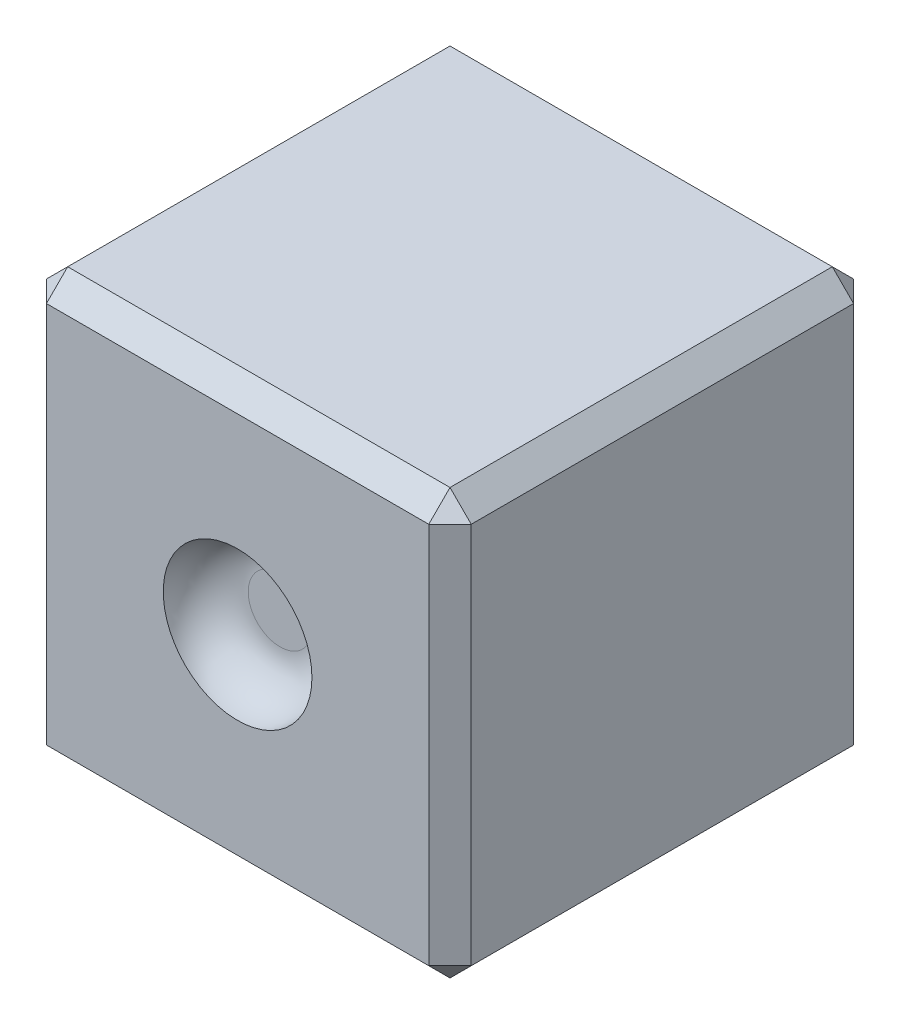
ISO-10303-21;
HEADER;
FILE_DESCRIPTION(('STEP AP214'),'2;1');
FILE_NAME('part.step','',(''),(''),'','','');
FILE_SCHEMA(('AUTOMOTIVE_DESIGN { 1 0 10303 214 1 1 1 1 }'));
ENDSEC;
DATA;
#1=APPLICATION_CONTEXT('core data for automotive mechanical design processes');
#2=APPLICATION_PROTOCOL_DEFINITION('international standard','automotive_design',2000,#1);
#3=PRODUCT_CONTEXT('',#1,'mechanical');
#4=PRODUCT('Part','Part','',(#3));
#5=PRODUCT_RELATED_PRODUCT_CATEGORY('part','',(#4));
#6=PRODUCT_DEFINITION_FORMATION('','',#4);
#7=PRODUCT_DEFINITION_CONTEXT('part definition',#1,'design');
#8=PRODUCT_DEFINITION('design','',#6,#7);
#9=PRODUCT_DEFINITION_SHAPE('','',#8);
#10=(LENGTH_UNIT() NAMED_UNIT(*) SI_UNIT(.MILLI.,.METRE.));
#11=(NAMED_UNIT(*) PLANE_ANGLE_UNIT() SI_UNIT($,.RADIAN.));
#12=(NAMED_UNIT(*) SI_UNIT($,.STERADIAN.) SOLID_ANGLE_UNIT());
#13=UNCERTAINTY_MEASURE_WITH_UNIT(LENGTH_MEASURE(1.E-05),#10,'distance_accuracy_value','');
#14=(GEOMETRIC_REPRESENTATION_CONTEXT(3) GLOBAL_UNCERTAINTY_ASSIGNED_CONTEXT((#13)) GLOBAL_UNIT_ASSIGNED_CONTEXT((#10,
#11,#12)) REPRESENTATION_CONTEXT('',''));
#15=CARTESIAN_POINT('',(0.,0.,0.));
#16=DIRECTION('',(0.,0.,1.));
#17=DIRECTION('',(1.,0.,0.));
#18=AXIS2_PLACEMENT_3D('',#15,#16,#17);
#19=CARTESIAN_POINT('',(-24.5864661654135,15.1691729323308,20.));
#20=DIRECTION('',(1.,0.,0.));
#21=DIRECTION('',(0.,1.,0.));
#22=AXIS2_PLACEMENT_3D('',#19,#20,#21);
#23=PLANE('',#22);
#24=DIRECTION('',(0.,0.,-1.));
#25=VECTOR('',#24,1.);
#26=CARTESIAN_POINT('',(-24.5864661654135,-4.83082706766917,20.));
#27=LINE('',#26,#25);
#28=CARTESIAN_POINT('',(-24.5864661654135,-4.83082706766917,19.));
#29=VERTEX_POINT('',#28);
#30=CARTESIAN_POINT('',(-24.5864661654135,-4.83082706766917,0.));
#31=VERTEX_POINT('',#30);
#32=EDGE_CURVE('E120',#29,#31,#27,.T.);
#33=ORIENTED_EDGE('',*,*,#32,.F.);
#34=DIRECTION('',(0.,1.,0.));
#35=VECTOR('',#34,1.);
#36=CARTESIAN_POINT('',(-24.5864661654135,15.1691729323308,19.));
#37=LINE('',#36,#35);
#38=CARTESIAN_POINT('',(-24.5864661654135,14.1691729323308,19.));
#39=VERTEX_POINT('',#38);
#40=EDGE_CURVE('E70',#29,#39,#37,.T.);
#41=ORIENTED_EDGE('',*,*,#40,.T.);
#42=DIRECTION('',(0.,0.,-1.));
#43=VECTOR('',#42,1.);
#44=CARTESIAN_POINT('',(-24.5864661654135,14.1691729323308,20.));
#45=LINE('',#44,#43);
#46=CARTESIAN_POINT('',(-24.5864661654135,14.1691729323308,0.));
#47=VERTEX_POINT('',#46);
#48=EDGE_CURVE('E130',#39,#47,#45,.T.);
#49=ORIENTED_EDGE('',*,*,#48,.T.);
#50=DIRECTION('',(0.,-1.,0.));
#51=VECTOR('',#50,1.);
#52=CARTESIAN_POINT('',(-24.5864661654135,15.1691729323308,0.));
#53=LINE('',#52,#51);
#54=EDGE_CURVE('E128',#47,#31,#53,.T.);
#55=ORIENTED_EDGE('',*,*,#54,.T.);
#56=EDGE_LOOP('',(#33,#41,#49,#55));
#57=FACE_BOUND('',#56,.T.);
#58=ADVANCED_FACE('F47',(#57),#23,.F.);
#59=CARTESIAN_POINT('',(-24.5864661654135,-4.83082706766917,20.));
#60=DIRECTION('',(0.,1.,0.));
#61=DIRECTION('',(0.,0.,1.));
#62=AXIS2_PLACEMENT_3D('',#59,#60,#61);
#63=PLANE('',#62);
#64=DIRECTION('',(0.,0.,1.));
#65=VECTOR('',#64,1.);
#66=CARTESIAN_POINT('',(-5.58646616541355,-4.83082706766917,20.));
#67=LINE('',#66,#65);
#68=CARTESIAN_POINT('',(-5.58646616541355,-4.83082706766917,0.));
#69=VERTEX_POINT('',#68);
#70=CARTESIAN_POINT('',(-5.58646616541355,-4.83082706766917,19.));
#71=VERTEX_POINT('',#70);
#72=EDGE_CURVE('E62',#69,#71,#67,.T.);
#73=ORIENTED_EDGE('',*,*,#72,.T.);
#74=DIRECTION('',(-1.,0.,0.));
#75=VECTOR('',#74,1.);
#76=CARTESIAN_POINT('',(-24.5864661654135,-4.83082706766917,19.));
#77=LINE('',#76,#75);
#78=EDGE_CURVE('E55',#71,#29,#77,.T.);
#79=ORIENTED_EDGE('',*,*,#78,.T.);
#80=ORIENTED_EDGE('',*,*,#32,.T.);
#81=DIRECTION('',(1.,0.,0.));
#82=VECTOR('',#81,1.);
#83=CARTESIAN_POINT('',(-24.5864661654135,-4.83082706766917,0.));
#84=LINE('',#83,#82);
#85=EDGE_CURVE('E124',#31,#69,#84,.T.);
#86=ORIENTED_EDGE('',*,*,#85,.T.);
#87=EDGE_LOOP('',(#73,#79,#80,#86));
#88=FACE_BOUND('',#87,.T.);
#89=ADVANCED_FACE('F122',(#88),#63,.F.);
#90=CARTESIAN_POINT('',(-4.58646616541355,15.1691729323308,20.));
#91=DIRECTION('',(-1.,0.,0.));
#92=DIRECTION('',(0.,-1.,0.));
#93=AXIS2_PLACEMENT_3D('',#90,#91,#92);
#94=PLANE('',#93);
#95=DIRECTION('',(0.,0.,-1.));
#96=VECTOR('',#95,1.);
#97=CARTESIAN_POINT('',(-4.58646616541354,-3.83082706766917,20.));
#98=LINE('',#97,#96);
#99=CARTESIAN_POINT('',(-4.58646616541354,-3.83082706766917,19.));
#100=VERTEX_POINT('',#99);
#101=CARTESIAN_POINT('',(-4.58646616541354,-3.83082706766917,0.999999999999997));
#102=VERTEX_POINT('',#101);
#103=EDGE_CURVE('E125',#100,#102,#98,.T.);
#104=ORIENTED_EDGE('',*,*,#103,.T.);
#105=DIRECTION('',(0.,1.,0.));
#106=VECTOR('',#105,1.);
#107=CARTESIAN_POINT('',(-4.58646616541355,15.1691729323308,0.999999999999997));
#108=LINE('',#107,#106);
#109=CARTESIAN_POINT('',(-4.58646616541355,14.1691729323308,0.999999999999997));
#110=VERTEX_POINT('',#109);
#111=EDGE_CURVE('E147',#102,#110,#108,.T.);
#112=ORIENTED_EDGE('',*,*,#111,.T.);
#113=DIRECTION('',(0.,0.,1.));
#114=VECTOR('',#113,1.);
#115=CARTESIAN_POINT('',(-4.58646616541355,14.1691729323308,20.));
#116=LINE('',#115,#114);
#117=CARTESIAN_POINT('',(-4.58646616541355,14.1691729323308,19.));
#118=VERTEX_POINT('',#117);
#119=EDGE_CURVE('E145',#110,#118,#116,.T.);
#120=ORIENTED_EDGE('',*,*,#119,.T.);
#121=DIRECTION('',(0.,-1.,0.));
#122=VECTOR('',#121,1.);
#123=CARTESIAN_POINT('',(-4.58646616541354,-4.83082706766917,19.));
#124=LINE('',#123,#122);
#125=EDGE_CURVE('E143',#118,#100,#124,.T.);
#126=ORIENTED_EDGE('',*,*,#125,.T.);
#127=EDGE_LOOP('',(#104,#112,#120,#126));
#128=FACE_BOUND('',#127,.T.);
#129=ADVANCED_FACE('F245',(#128),#94,.F.);
#130=CARTESIAN_POINT('',(-24.5864661654135,15.1691729323308,20.));
#131=DIRECTION('',(0.,-1.,0.));
#132=DIRECTION('',(0.,0.,-1.));
#133=AXIS2_PLACEMENT_3D('',#130,#131,#132);
#134=PLANE('',#133);
#135=DIRECTION('',(0.,0.,-1.));
#136=VECTOR('',#135,1.);
#137=CARTESIAN_POINT('',(-5.58646616541355,15.1691729323308,20.));
#138=LINE('',#137,#136);
#139=CARTESIAN_POINT('',(-5.58646616541355,15.1691729323308,19.));
#140=VERTEX_POINT('',#139);
#141=CARTESIAN_POINT('',(-5.58646616541355,15.1691729323308,0.999999999999997));
#142=VERTEX_POINT('',#141);
#143=EDGE_CURVE('E153',#140,#142,#138,.T.);
#144=ORIENTED_EDGE('',*,*,#143,.T.);
#145=DIRECTION('',(-1.,0.,0.));
#146=VECTOR('',#145,1.);
#147=CARTESIAN_POINT('',(-24.5864661654135,15.1691729323308,0.999999999999997));
#148=LINE('',#147,#146);
#149=CARTESIAN_POINT('',(-23.5864661654135,15.1691729323308,0.999999999999997));
#150=VERTEX_POINT('',#149);
#151=EDGE_CURVE('E159',#142,#150,#148,.T.);
#152=ORIENTED_EDGE('',*,*,#151,.T.);
#153=DIRECTION('',(0.,0.,1.));
#154=VECTOR('',#153,1.);
#155=CARTESIAN_POINT('',(-23.5864661654135,15.1691729323308,20.));
#156=LINE('',#155,#154);
#157=CARTESIAN_POINT('',(-23.5864661654135,15.1691729323308,19.));
#158=VERTEX_POINT('',#157);
#159=EDGE_CURVE('E157',#150,#158,#156,.T.);
#160=ORIENTED_EDGE('',*,*,#159,.T.);
#161=DIRECTION('',(1.,0.,0.));
#162=VECTOR('',#161,1.);
#163=CARTESIAN_POINT('',(-4.58646616541355,15.1691729323308,19.));
#164=LINE('',#163,#162);
#165=EDGE_CURVE('E155',#158,#140,#164,.T.);
#166=ORIENTED_EDGE('',*,*,#165,.T.);
#167=EDGE_LOOP('',(#144,#152,#160,#166));
#168=FACE_BOUND('',#167,.T.);
#169=ADVANCED_FACE('F271',(#168),#134,.F.);
#170=CARTESIAN_POINT('',(0.,0.,20.));
#171=DIRECTION('',(0.,0.,1.));
#172=DIRECTION('',(1.,0.,0.));
#173=AXIS2_PLACEMENT_3D('',#170,#171,#172);
#174=PLANE('',#173);
#175=CARTESIAN_POINT('',(-14.5864661654135,5.16917293233083,20.));
#176=DIRECTION('',(0.,0.,1.));
#177=DIRECTION('',(1.,0.,0.));
#178=AXIS2_PLACEMENT_3D('',#175,#176,#177);
#179=CIRCLE('',#178,3.5);
#180=CARTESIAN_POINT('',(-11.0864661654135,5.16917293233083,20.));
#181=VERTEX_POINT('',#180);
#182=EDGE_CURVE('E178',#181,#181,#179,.T.);
#183=ORIENTED_EDGE('',*,*,#182,.F.);
#184=EDGE_LOOP('',(#183));
#185=FACE_BOUND('',#184,.T.);
#186=DIRECTION('',(-1.,0.,0.));
#187=VECTOR('',#186,1.);
#188=CARTESIAN_POINT('',(-24.5864661654135,14.1691729323308,20.));
#189=LINE('',#188,#187);
#190=CARTESIAN_POINT('',(-5.58646616541355,14.1691729323308,20.));
#191=VERTEX_POINT('',#190);
#192=CARTESIAN_POINT('',(-23.5864661654136,14.1691729323308,20.));
#193=VERTEX_POINT('',#192);
#194=EDGE_CURVE('E164',#191,#193,#189,.T.);
#195=ORIENTED_EDGE('',*,*,#194,.T.);
#196=DIRECTION('',(0.,-1.,0.));
#197=VECTOR('',#196,1.);
#198=CARTESIAN_POINT('',(-23.5864661654135,-4.83082706766917,20.));
#199=LINE('',#198,#197);
#200=CARTESIAN_POINT('',(-23.5864661654135,-3.83082706766917,20.));
#201=VERTEX_POINT('',#200);
#202=EDGE_CURVE('E168',#193,#201,#199,.T.);
#203=ORIENTED_EDGE('',*,*,#202,.T.);
#204=DIRECTION('',(1.,0.,0.));
#205=VECTOR('',#204,1.);
#206=CARTESIAN_POINT('',(-4.58646616541354,-3.83082706766917,20.));
#207=LINE('',#206,#205);
#208=CARTESIAN_POINT('',(-5.58646616541355,-3.83082706766917,20.));
#209=VERTEX_POINT('',#208);
#210=EDGE_CURVE('E166',#201,#209,#207,.T.);
#211=ORIENTED_EDGE('',*,*,#210,.T.);
#212=DIRECTION('',(0.,1.,0.));
#213=VECTOR('',#212,1.);
#214=CARTESIAN_POINT('',(-5.58646616541355,15.1691729323308,20.));
#215=LINE('',#214,#213);
#216=EDGE_CURVE('E162',#209,#191,#215,.T.);
#217=ORIENTED_EDGE('',*,*,#216,.T.);
#218=EDGE_LOOP('',(#195,#203,#211,#217));
#219=FACE_BOUND('',#218,.T.);
#220=ADVANCED_FACE('F261',(#185,#219),#174,.T.);
#221=CARTESIAN_POINT('',(0.,0.,0.));
#222=DIRECTION('',(0.,0.,1.));
#223=DIRECTION('',(1.,0.,0.));
#224=AXIS2_PLACEMENT_3D('',#221,#222,#223);
#225=PLANE('',#224);
#226=DIRECTION('',(1.,0.,0.));
#227=VECTOR('',#226,1.);
#228=CARTESIAN_POINT('',(0.,14.1691729323308,0.));
#229=LINE('',#228,#227);
#230=CARTESIAN_POINT('',(-5.58646616541355,14.1691729323308,0.));
#231=VERTEX_POINT('',#230);
#232=EDGE_CURVE('E150',#47,#231,#229,.T.);
#233=ORIENTED_EDGE('',*,*,#232,.T.);
#234=DIRECTION('',(0.,-1.,0.));
#235=VECTOR('',#234,1.);
#236=CARTESIAN_POINT('',(-5.58646616541355,0.,0.));
#237=LINE('',#236,#235);
#238=EDGE_CURVE('E138',#231,#69,#237,.T.);
#239=ORIENTED_EDGE('',*,*,#238,.T.);
#240=ORIENTED_EDGE('',*,*,#85,.F.);
#241=ORIENTED_EDGE('',*,*,#54,.F.);
#242=EDGE_LOOP('',(#233,#239,#240,#241));
#243=FACE_BOUND('',#242,.T.);
#244=ADVANCED_FACE('F136',(#243),#225,.F.);
#245=CARTESIAN_POINT('',(-23.5864661654135,0.,20.));
#246=DIRECTION('',(-0.70710678118655,0.,0.707106781186545));
#247=DIRECTION('',(0.,1.,0.));
#248=AXIS2_PLACEMENT_3D('',#245,#246,#247);
#249=PLANE('',#248);
#250=DIRECTION('',(-0.577350269189625,-0.577350269189624,-0.577350269189628));
#251=VECTOR('',#250,1.);
#252=CARTESIAN_POINT('',(-15.7243107769424,4.03132832080198,27.8621553884712));
#253=LINE('',#252,#251);
#254=EDGE_CURVE('E209',#201,#29,#253,.T.);
#255=ORIENTED_EDGE('',*,*,#254,.F.);
#256=ORIENTED_EDGE('',*,*,#202,.F.);
#257=DIRECTION('',(0.707106781186545,0.,0.70710678118655));
#258=VECTOR('',#257,1.);
#259=CARTESIAN_POINT('',(-24.5864661654135,14.1691729323308,19.));
#260=LINE('',#259,#258);
#261=EDGE_CURVE('E212',#39,#193,#260,.T.);
#262=ORIENTED_EDGE('',*,*,#261,.F.);
#263=ORIENTED_EDGE('',*,*,#40,.F.);
#264=EDGE_LOOP('',(#255,#256,#262,#263));
#265=FACE_BOUND('',#264,.T.);
#266=ADVANCED_FACE('F259',(#265),#249,.T.);
#267=CARTESIAN_POINT('',(0.,14.1691729323308,20.));
#268=DIRECTION('',(0.,0.70710678118655,0.707106781186545));
#269=DIRECTION('',(1.,0.,0.));
#270=AXIS2_PLACEMENT_3D('',#267,#268,#269);
#271=PLANE('',#270);
#272=DIRECTION('',(0.,0.707106781186545,-0.70710678118655));
#273=VECTOR('',#272,1.);
#274=CARTESIAN_POINT('',(-23.5864661654135,14.6691729323308,19.5));
#275=LINE('',#274,#273);
#276=EDGE_CURVE('E133',#193,#158,#275,.T.);
#277=ORIENTED_EDGE('',*,*,#276,.F.);
#278=ORIENTED_EDGE('',*,*,#194,.F.);
#279=DIRECTION('',(0.,-0.707106781186545,0.70710678118655));
#280=VECTOR('',#279,1.);
#281=CARTESIAN_POINT('',(-5.58646616541355,15.1691729323308,19.));
#282=LINE('',#281,#280);
#283=EDGE_CURVE('E203',#140,#191,#282,.T.);
#284=ORIENTED_EDGE('',*,*,#283,.F.);
#285=ORIENTED_EDGE('',*,*,#165,.F.);
#286=EDGE_LOOP('',(#277,#278,#284,#285));
#287=FACE_BOUND('',#286,.T.);
#288=ADVANCED_FACE('F265',(#287),#271,.T.);
#289=CARTESIAN_POINT('',(-24.5864661654135,14.1691729323308,19.));
#290=DIRECTION('',(-0.577350269189626,0.57735026918963,0.577350269189622));
#291=DIRECTION('',(-0.70710678118655,-0.707106781186545,0.));
#292=AXIS2_PLACEMENT_3D('',#289,#290,#291);
#293=PLANE('',#292);
#294=ORIENTED_EDGE('',*,*,#261,.T.);
#295=ORIENTED_EDGE('',*,*,#276,.T.);
#296=DIRECTION('',(0.70710678118655,0.707106781186545,0.));
#297=VECTOR('',#296,1.);
#298=CARTESIAN_POINT('',(-24.5864661654135,14.1691729323308,19.));
#299=LINE('',#298,#297);
#300=EDGE_CURVE('E200',#39,#158,#299,.T.);
#301=ORIENTED_EDGE('',*,*,#300,.F.);
#302=EDGE_LOOP('',(#294,#295,#301));
#303=FACE_BOUND('',#302,.T.);
#304=ADVANCED_FACE('F218',(#303),#293,.T.);
#305=CARTESIAN_POINT('',(0.,-3.83082706766917,20.));
#306=DIRECTION('',(0.,-0.70710678118655,0.707106781186545));
#307=DIRECTION('',(-1.,0.,0.));
#308=AXIS2_PLACEMENT_3D('',#305,#306,#307);
#309=PLANE('',#308);
#310=ORIENTED_EDGE('',*,*,#254,.T.);
#311=ORIENTED_EDGE('',*,*,#78,.F.);
#312=DIRECTION('',(0.,-0.707106781186545,-0.70710678118655));
#313=VECTOR('',#312,1.);
#314=CARTESIAN_POINT('',(-5.58646616541355,-3.83082706766917,20.));
#315=LINE('',#314,#313);
#316=EDGE_CURVE('E197',#209,#71,#315,.T.);
#317=ORIENTED_EDGE('',*,*,#316,.F.);
#318=ORIENTED_EDGE('',*,*,#210,.F.);
#319=EDGE_LOOP('',(#310,#311,#317,#318));
#320=FACE_BOUND('',#319,.T.);
#321=ADVANCED_FACE('F255',(#320),#309,.T.);
#322=CARTESIAN_POINT('',(-5.58646616541355,0.,20.));
#323=DIRECTION('',(0.707106781186545,0.,0.70710678118655));
#324=DIRECTION('',(0.,-1.,0.));
#325=AXIS2_PLACEMENT_3D('',#322,#323,#324);
#326=PLANE('',#325);
#327=DIRECTION('',(0.70710678118655,0.,-0.707106781186545));
#328=VECTOR('',#327,1.);
#329=CARTESIAN_POINT('',(-5.08646616541355,14.1691729323308,19.5));
#330=LINE('',#329,#328);
#331=EDGE_CURVE('E206',#191,#118,#330,.T.);
#332=ORIENTED_EDGE('',*,*,#331,.F.);
#333=ORIENTED_EDGE('',*,*,#216,.F.);
#334=DIRECTION('',(-0.70710678118655,0.,0.707106781186545));
#335=VECTOR('',#334,1.);
#336=CARTESIAN_POINT('',(-5.58646616541355,-3.83082706766917,20.));
#337=LINE('',#336,#335);
#338=EDGE_CURVE('E194',#100,#209,#337,.T.);
#339=ORIENTED_EDGE('',*,*,#338,.F.);
#340=ORIENTED_EDGE('',*,*,#125,.F.);
#341=EDGE_LOOP('',(#332,#333,#339,#340));
#342=FACE_BOUND('',#341,.T.);
#343=ADVANCED_FACE('F267',(#342),#326,.T.);
#344=CARTESIAN_POINT('',(-5.58646616541355,15.1691729323308,19.));
#345=DIRECTION('',(0.577350269189622,0.57735026918963,0.577350269189626));
#346=DIRECTION('',(0.,-0.707106781186545,0.70710678118655));
#347=AXIS2_PLACEMENT_3D('',#344,#345,#346);
#348=PLANE('',#347);
#349=ORIENTED_EDGE('',*,*,#283,.T.);
#350=ORIENTED_EDGE('',*,*,#331,.T.);
#351=DIRECTION('',(0.70710678118655,-0.707106781186545,0.));
#352=VECTOR('',#351,1.);
#353=CARTESIAN_POINT('',(-5.58646616541355,15.1691729323308,19.));
#354=LINE('',#353,#352);
#355=EDGE_CURVE('E191',#140,#118,#354,.T.);
#356=ORIENTED_EDGE('',*,*,#355,.F.);
#357=EDGE_LOOP('',(#349,#350,#356));
#358=FACE_BOUND('',#357,.T.);
#359=ADVANCED_FACE('F269',(#358),#348,.T.);
#360=CARTESIAN_POINT('',(-24.5864661654135,14.1691729323308,20.));
#361=DIRECTION('',(0.707106781186545,-0.70710678118655,0.));
#362=DIRECTION('',(0.,0.,-1.));
#363=AXIS2_PLACEMENT_3D('',#360,#361,#362);
#364=PLANE('',#363);
#365=ORIENTED_EDGE('',*,*,#300,.T.);
#366=ORIENTED_EDGE('',*,*,#159,.F.);
#367=DIRECTION('',(-0.57735026918963,-0.577350269189626,-0.577350269189622));
#368=VECTOR('',#367,1.);
#369=CARTESIAN_POINT('',(-17.9197994987469,20.8358395989975,6.66666666666658));
#370=LINE('',#369,#368);
#371=EDGE_CURVE('E189',#47,#150,#370,.F.);
#372=ORIENTED_EDGE('',*,*,#371,.F.);
#373=ORIENTED_EDGE('',*,*,#48,.F.);
#374=EDGE_LOOP('',(#365,#366,#372,#373));
#375=FACE_BOUND('',#374,.T.);
#376=ADVANCED_FACE('F224',(#375),#364,.F.);
#377=CARTESIAN_POINT('',(-5.58646616541355,-3.83082706766917,20.));
#378=DIRECTION('',(0.577350269189622,-0.57735026918963,0.577350269189626));
#379=DIRECTION('',(0.,-0.707106781186545,-0.70710678118655));
#380=AXIS2_PLACEMENT_3D('',#377,#378,#379);
#381=PLANE('',#380);
#382=ORIENTED_EDGE('',*,*,#338,.T.);
#383=ORIENTED_EDGE('',*,*,#316,.T.);
#384=DIRECTION('',(-0.70710678118655,-0.707106781186545,0.));
#385=VECTOR('',#384,1.);
#386=CARTESIAN_POINT('',(-5.08646616541355,-4.33082706766917,19.));
#387=LINE('',#386,#385);
#388=EDGE_CURVE('E186',#100,#71,#387,.T.);
#389=ORIENTED_EDGE('',*,*,#388,.F.);
#390=EDGE_LOOP('',(#382,#383,#389));
#391=FACE_BOUND('',#390,.T.);
#392=ADVANCED_FACE('F252',(#391),#381,.T.);
#393=CARTESIAN_POINT('',(-5.58646616541355,15.1691729323308,20.));
#394=DIRECTION('',(-0.707106781186545,-0.70710678118655,0.));
#395=DIRECTION('',(0.,0.,-1.));
#396=AXIS2_PLACEMENT_3D('',#393,#394,#395);
#397=PLANE('',#396);
#398=ORIENTED_EDGE('',*,*,#355,.T.);
#399=ORIENTED_EDGE('',*,*,#119,.F.);
#400=DIRECTION('',(-0.70710678118655,0.707106781186545,0.));
#401=VECTOR('',#400,1.);
#402=CARTESIAN_POINT('',(-4.58646616541355,14.1691729323308,0.999999999999997));
#403=LINE('',#402,#401);
#404=EDGE_CURVE('E183',#142,#110,#403,.F.);
#405=ORIENTED_EDGE('',*,*,#404,.F.);
#406=ORIENTED_EDGE('',*,*,#143,.F.);
#407=EDGE_LOOP('',(#398,#399,#405,#406));
#408=FACE_BOUND('',#407,.T.);
#409=ADVANCED_FACE('F241',(#408),#397,.F.);
#410=CARTESIAN_POINT('',(-24.5864661654135,15.1691729323308,0.999999999999997));
#411=DIRECTION('',(0.,-0.707106781186545,0.70710678118655));
#412=DIRECTION('',(-1.,0.,0.));
#413=AXIS2_PLACEMENT_3D('',#410,#411,#412);
#414=PLANE('',#413);
#415=ORIENTED_EDGE('',*,*,#371,.T.);
#416=ORIENTED_EDGE('',*,*,#151,.F.);
#417=DIRECTION('',(0.,-0.70710678118655,-0.707106781186545));
#418=VECTOR('',#417,1.);
#419=CARTESIAN_POINT('',(-5.58646616541355,14.6691729323308,0.499999999999999));
#420=LINE('',#419,#418);
#421=EDGE_CURVE('E180',#231,#142,#420,.F.);
#422=ORIENTED_EDGE('',*,*,#421,.F.);
#423=ORIENTED_EDGE('',*,*,#232,.F.);
#424=EDGE_LOOP('',(#415,#416,#422,#423));
#425=FACE_BOUND('',#424,.T.);
#426=ADVANCED_FACE('F229',(#425),#414,.F.);
#427=CARTESIAN_POINT('',(-4.58646616541354,-3.83082706766917,20.));
#428=DIRECTION('',(-0.707106781186545,0.70710678118655,0.));
#429=DIRECTION('',(0.,0.,-1.));
#430=AXIS2_PLACEMENT_3D('',#427,#428,#429);
#431=PLANE('',#430);
#432=ORIENTED_EDGE('',*,*,#388,.T.);
#433=ORIENTED_EDGE('',*,*,#72,.F.);
#434=DIRECTION('',(0.577350269189628,0.577350269189624,0.577350269189624));
#435=VECTOR('',#434,1.);
#436=CARTESIAN_POINT('',(1.7468671679198,2.50250626566414,7.3333333333333));
#437=LINE('',#436,#435);
#438=EDGE_CURVE('E177',#102,#69,#437,.F.);
#439=ORIENTED_EDGE('',*,*,#438,.F.);
#440=ORIENTED_EDGE('',*,*,#103,.F.);
#441=EDGE_LOOP('',(#432,#433,#439,#440));
#442=FACE_BOUND('',#441,.T.);
#443=ADVANCED_FACE('F249',(#442),#431,.F.);
#444=CARTESIAN_POINT('',(-4.58646616541355,14.1691729323308,0.999999999999997));
#445=DIRECTION('',(0.577350269189622,0.577350269189626,-0.57735026918963));
#446=DIRECTION('',(0.,0.70710678118655,0.707106781186545));
#447=AXIS2_PLACEMENT_3D('',#444,#445,#446);
#448=PLANE('',#447);
#449=ORIENTED_EDGE('',*,*,#421,.T.);
#450=ORIENTED_EDGE('',*,*,#404,.T.);
#451=DIRECTION('',(0.70710678118655,0.,0.707106781186545));
#452=VECTOR('',#451,1.);
#453=CARTESIAN_POINT('',(-4.58646616541355,14.1691729323308,0.999999999999997));
#454=LINE('',#453,#452);
#455=EDGE_CURVE('E175',#231,#110,#454,.T.);
#456=ORIENTED_EDGE('',*,*,#455,.F.);
#457=EDGE_LOOP('',(#449,#450,#456));
#458=FACE_BOUND('',#457,.T.);
#459=ADVANCED_FACE('F237',(#458),#448,.T.);
#460=CARTESIAN_POINT('',(-4.58646616541355,15.1691729323308,0.999999999999997));
#461=DIRECTION('',(-0.707106781186545,0.,0.70710678118655));
#462=DIRECTION('',(0.,1.,0.));
#463=AXIS2_PLACEMENT_3D('',#460,#461,#462);
#464=PLANE('',#463);
#465=ORIENTED_EDGE('',*,*,#438,.T.);
#466=ORIENTED_EDGE('',*,*,#238,.F.);
#467=ORIENTED_EDGE('',*,*,#455,.T.);
#468=ORIENTED_EDGE('',*,*,#111,.F.);
#469=EDGE_LOOP('',(#465,#466,#467,#468));
#470=FACE_BOUND('',#469,.T.);
#471=ADVANCED_FACE('F234',(#470),#464,.F.);
#472=CARTESIAN_POINT('',(-14.5864661654135,5.16917293233083,18.));
#473=DIRECTION('',(0.,0.,1.));
#474=DIRECTION('',(1.,0.,0.));
#475=AXIS2_PLACEMENT_3D('',#472,#473,#474);
#476=PLANE('',#475);
#477=CARTESIAN_POINT('',(-14.5864661654135,5.16917293233083,18.));
#478=DIRECTION('',(0.,0.,1.));
#479=DIRECTION('',(1.,0.,0.));
#480=AXIS2_PLACEMENT_3D('',#477,#478,#479);
#481=CIRCLE('',#480,1.5);
#482=CARTESIAN_POINT('',(-13.0864661654135,5.16917293233083,18.));
#483=VERTEX_POINT('',#482);
#484=EDGE_CURVE('E11',#483,#483,#481,.T.);
#485=ORIENTED_EDGE('',*,*,#484,.T.);
#486=EDGE_LOOP('',(#485));
#487=FACE_BOUND('',#486,.T.);
#488=ADVANCED_FACE('F298',(#487),#476,.T.);
#489=CARTESIAN_POINT('',(-14.5864661654135,5.16917293233083,20.));
#490=DIRECTION('',(0.,0.,1.));
#491=DIRECTION('',(1.,0.,0.));
#492=AXIS2_PLACEMENT_3D('',#489,#490,#491);
#493=DEGENERATE_TOROIDAL_SURFACE('',#492,1.5,2.,.T.);
#494=ORIENTED_EDGE('',*,*,#182,.T.);
#495=EDGE_LOOP('',(#494));
#496=FACE_BOUND('',#495,.T.);
#497=ORIENTED_EDGE('',*,*,#484,.F.);
#498=EDGE_LOOP('',(#497));
#499=FACE_BOUND('',#498,.T.);
#500=ADVANCED_FACE('F49',(#496,#499),#493,.F.);
#501=CLOSED_SHELL('',(#58,#89,#129,#169,#220,#244,#266,#288,#304,#321,#343,#359,#376,#392,#409,
#426,#443,#459,#471,#488,#500));
#502=MANIFOLD_SOLID_BREP('B2',#501);
#503=ADVANCED_BREP_SHAPE_REPRESENTATION('',(#18,#502),#14);
#504=SHAPE_DEFINITION_REPRESENTATION(#9,#503);
ENDSEC;
END-ISO-10303-21;
